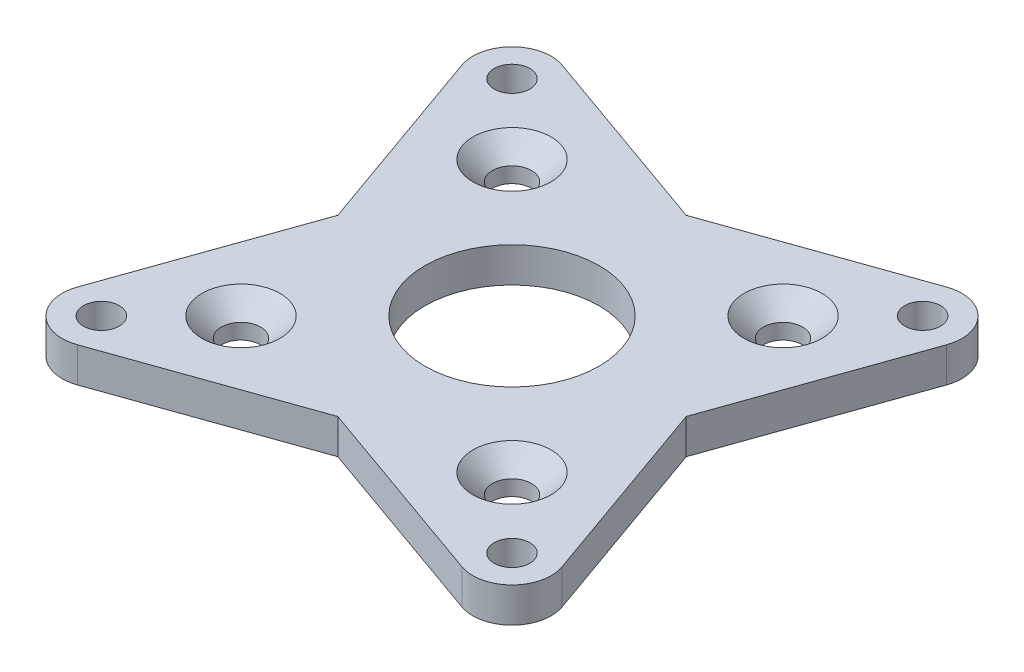
ISO-10303-21;
HEADER;
FILE_DESCRIPTION(('STEP AP214'),'2;1');
FILE_NAME('part.step','',(''),(''),'','','');
FILE_SCHEMA(('AUTOMOTIVE_DESIGN { 1 0 10303 214 1 1 1 1 }'));
ENDSEC;
DATA;
#1=APPLICATION_CONTEXT('core data for automotive mechanical design processes');
#2=APPLICATION_PROTOCOL_DEFINITION('international standard','automotive_design',2000,#1);
#3=PRODUCT_CONTEXT('',#1,'mechanical');
#4=PRODUCT('Part','Part','',(#3));
#5=PRODUCT_RELATED_PRODUCT_CATEGORY('part','',(#4));
#6=PRODUCT_DEFINITION_FORMATION('','',#4);
#7=PRODUCT_DEFINITION_CONTEXT('part definition',#1,'design');
#8=PRODUCT_DEFINITION('design','',#6,#7);
#9=PRODUCT_DEFINITION_SHAPE('','',#8);
#10=(LENGTH_UNIT() NAMED_UNIT(*) SI_UNIT(.MILLI.,.METRE.));
#11=(NAMED_UNIT(*) PLANE_ANGLE_UNIT() SI_UNIT($,.RADIAN.));
#12=(NAMED_UNIT(*) SI_UNIT($,.STERADIAN.) SOLID_ANGLE_UNIT());
#13=UNCERTAINTY_MEASURE_WITH_UNIT(LENGTH_MEASURE(1.E-05),#10,'distance_accuracy_value','');
#14=(GEOMETRIC_REPRESENTATION_CONTEXT(3) GLOBAL_UNCERTAINTY_ASSIGNED_CONTEXT((#13)) GLOBAL_UNIT_ASSIGNED_CONTEXT((#10,
#11,#12)) REPRESENTATION_CONTEXT('',''));
#15=CARTESIAN_POINT('',(0.,0.,0.));
#16=DIRECTION('',(0.,0.,1.));
#17=DIRECTION('',(1.,0.,0.));
#18=AXIS2_PLACEMENT_3D('',#15,#16,#17);
#19=CARTESIAN_POINT('',(0.,4.,0.));
#20=DIRECTION('',(0.,-1.,0.));
#21=DIRECTION('',(0.,0.,-1.));
#22=AXIS2_PLACEMENT_3D('',#19,#20,#21);
#23=PLANE('',#22);
#24=CARTESIAN_POINT('',(-15.556349186104,4.,-15.556349186104));
#25=DIRECTION('',(0.,1.,0.));
#26=DIRECTION('',(0.,0.,1.));
#27=AXIS2_PLACEMENT_3D('',#24,#25,#26);
#28=CIRCLE('',#27,4.48);
#29=CARTESIAN_POINT('',(-15.556349186104,4.,-11.076349186104));
#30=VERTEX_POINT('',#29);
#31=EDGE_CURVE('E313',#30,#30,#28,.T.);
#32=ORIENTED_EDGE('',*,*,#31,.F.);
#33=EDGE_LOOP('',(#32));
#34=FACE_BOUND('',#33,.T.);
#35=CARTESIAN_POINT('',(15.556349186104,4.,-15.556349186104));
#36=DIRECTION('',(0.,1.,0.));
#37=DIRECTION('',(0.,0.,1.));
#38=AXIS2_PLACEMENT_3D('',#35,#36,#37);
#39=CIRCLE('',#38,4.48);
#40=CARTESIAN_POINT('',(15.556349186104,4.,-11.076349186104));
#41=VERTEX_POINT('',#40);
#42=EDGE_CURVE('E304',#41,#41,#39,.T.);
#43=ORIENTED_EDGE('',*,*,#42,.F.);
#44=EDGE_LOOP('',(#43));
#45=FACE_BOUND('',#44,.T.);
#46=CARTESIAN_POINT('',(15.556349186104,4.,15.556349186104));
#47=DIRECTION('',(0.,1.,0.));
#48=DIRECTION('',(0.,0.,1.));
#49=AXIS2_PLACEMENT_3D('',#46,#47,#48);
#50=CIRCLE('',#49,4.48);
#51=CARTESIAN_POINT('',(15.556349186104,4.,20.036349186104));
#52=VERTEX_POINT('',#51);
#53=EDGE_CURVE('E295',#52,#52,#50,.T.);
#54=ORIENTED_EDGE('',*,*,#53,.F.);
#55=EDGE_LOOP('',(#54));
#56=FACE_BOUND('',#55,.T.);
#57=CARTESIAN_POINT('',(-15.556349186104,4.,15.556349186104));
#58=DIRECTION('',(0.,1.,0.));
#59=DIRECTION('',(0.,0.,1.));
#60=AXIS2_PLACEMENT_3D('',#57,#58,#59);
#61=CIRCLE('',#60,4.48);
#62=CARTESIAN_POINT('',(-15.556349186104,4.,20.036349186104));
#63=VERTEX_POINT('',#62);
#64=EDGE_CURVE('E286',#63,#63,#61,.T.);
#65=ORIENTED_EDGE('',*,*,#64,.F.);
#66=EDGE_LOOP('',(#65));
#67=FACE_BOUND('',#66,.T.);
#68=CARTESIAN_POINT('',(-23.57,4.,23.57));
#69=DIRECTION('',(0.,1.,0.));
#70=DIRECTION('',(0.,0.,1.));
#71=AXIS2_PLACEMENT_3D('',#68,#69,#70);
#72=CIRCLE('',#71,2.05000000000031);
#73=CARTESIAN_POINT('',(-23.57,4.,25.6200000000003));
#74=VERTEX_POINT('',#73);
#75=EDGE_CURVE('E247',#74,#74,#72,.T.);
#76=ORIENTED_EDGE('',*,*,#75,.F.);
#77=EDGE_LOOP('',(#76));
#78=FACE_BOUND('',#77,.T.);
#79=CARTESIAN_POINT('',(23.57,4.,23.57));
#80=DIRECTION('',(0.,1.,0.));
#81=DIRECTION('',(0.,0.,1.));
#82=AXIS2_PLACEMENT_3D('',#79,#80,#81);
#83=CIRCLE('',#82,2.05000000000021);
#84=CARTESIAN_POINT('',(23.57,4.,25.6200000000002));
#85=VERTEX_POINT('',#84);
#86=EDGE_CURVE('E240',#85,#85,#83,.T.);
#87=ORIENTED_EDGE('',*,*,#86,.F.);
#88=EDGE_LOOP('',(#87));
#89=FACE_BOUND('',#88,.T.);
#90=CARTESIAN_POINT('',(-23.57,4.,-23.57));
#91=DIRECTION('',(0.,1.,0.));
#92=DIRECTION('',(0.,0.,1.));
#93=AXIS2_PLACEMENT_3D('',#90,#91,#92);
#94=CIRCLE('',#93,2.05);
#95=CARTESIAN_POINT('',(-23.57,4.,-21.52));
#96=VERTEX_POINT('',#95);
#97=EDGE_CURVE('E12',#96,#96,#94,.T.);
#98=ORIENTED_EDGE('',*,*,#97,.F.);
#99=EDGE_LOOP('',(#98));
#100=FACE_BOUND('',#99,.T.);
#101=CARTESIAN_POINT('',(23.57,4.,-23.57));
#102=DIRECTION('',(0.,1.,0.));
#103=DIRECTION('',(0.,0.,1.));
#104=AXIS2_PLACEMENT_3D('',#101,#102,#103);
#105=CIRCLE('',#104,2.0500000000001);
#106=CARTESIAN_POINT('',(23.57,4.,-21.5199999999999));
#107=VERTEX_POINT('',#106);
#108=EDGE_CURVE('E252',#107,#107,#105,.T.);
#109=ORIENTED_EDGE('',*,*,#108,.F.);
#110=EDGE_LOOP('',(#109));
#111=FACE_BOUND('',#110,.T.);
#112=CARTESIAN_POINT('',(0.,4.,0.));
#113=DIRECTION('',(0.,1.,0.));
#114=DIRECTION('',(0.,0.,1.));
#115=AXIS2_PLACEMENT_3D('',#112,#113,#114);
#116=CIRCLE('',#115,10.);
#117=CARTESIAN_POINT('',(0.,4.,10.));
#118=VERTEX_POINT('',#117);
#119=EDGE_CURVE('E216',#118,#118,#116,.T.);
#120=ORIENTED_EDGE('',*,*,#119,.F.);
#121=EDGE_LOOP('',(#120));
#122=FACE_BOUND('',#121,.T.);
#123=DIRECTION('',(0.333702262673008,0.,0.942678524146442));
#124=VECTOR('',#123,1.);
#125=CARTESIAN_POINT('',(-27.812053358659,4.,-22.0683398179715));
#126=LINE('',#125,#124);
#127=CARTESIAN_POINT('',(-27.8120533586587,4.,-22.0683398179716));
#128=VERTEX_POINT('',#127);
#129=CARTESIAN_POINT('',(-20.,4.,0.));
#130=VERTEX_POINT('',#129);
#131=EDGE_CURVE('E181',#128,#130,#126,.T.);
#132=ORIENTED_EDGE('',*,*,#131,.T.);
#133=DIRECTION('',(-0.333702262673009,0.,0.942678524146442));
#134=VECTOR('',#133,1.);
#135=CARTESIAN_POINT('',(-20.,4.,0.));
#136=LINE('',#135,#134);
#137=CARTESIAN_POINT('',(-27.812053358659,4.,22.0683398179715));
#138=VERTEX_POINT('',#137);
#139=EDGE_CURVE('E184',#130,#138,#136,.T.);
#140=ORIENTED_EDGE('',*,*,#139,.T.);
#141=CARTESIAN_POINT('',(-23.5700000000002,4.,23.5699999999998));
#142=DIRECTION('',(0.,1.,0.));
#143=DIRECTION('',(0.,0.,1.));
#144=AXIS2_PLACEMENT_3D('',#141,#142,#143);
#145=CIRCLE('',#144,4.5);
#146=CARTESIAN_POINT('',(-22.0683398179715,4.,27.8120533586588));
#147=VERTEX_POINT('',#146);
#148=EDGE_CURVE('E59',#138,#147,#145,.T.);
#149=ORIENTED_EDGE('',*,*,#148,.T.);
#150=DIRECTION('',(0.942678524146443,0.,-0.333702262673008));
#151=VECTOR('',#150,1.);
#152=CARTESIAN_POINT('',(-22.0683398179715,4.,27.812053358659));
#153=LINE('',#152,#151);
#154=CARTESIAN_POINT('',(0.,4.,20.));
#155=VERTEX_POINT('',#154);
#156=EDGE_CURVE('E140',#147,#155,#153,.T.);
#157=ORIENTED_EDGE('',*,*,#156,.T.);
#158=DIRECTION('',(0.942678524146442,0.,0.333702262673008));
#159=VECTOR('',#158,1.);
#160=CARTESIAN_POINT('',(0.,4.,20.));
#161=LINE('',#160,#159);
#162=CARTESIAN_POINT('',(22.0683398179715,4.,27.812053358659));
#163=VERTEX_POINT('',#162);
#164=EDGE_CURVE('E190',#155,#163,#161,.T.);
#165=ORIENTED_EDGE('',*,*,#164,.T.);
#166=CARTESIAN_POINT('',(23.5699999999999,4.,23.5700000000001));
#167=DIRECTION('',(0.,1.,0.));
#168=DIRECTION('',(0.,0.,1.));
#169=AXIS2_PLACEMENT_3D('',#166,#167,#168);
#170=CIRCLE('',#169,4.5);
#171=CARTESIAN_POINT('',(27.8120533586589,4.,22.0683398179715));
#172=VERTEX_POINT('',#171);
#173=EDGE_CURVE('E193',#163,#172,#170,.T.);
#174=ORIENTED_EDGE('',*,*,#173,.T.);
#175=DIRECTION('',(-0.333702262673008,0.,-0.942678524146442));
#176=VECTOR('',#175,1.);
#177=CARTESIAN_POINT('',(27.812053358659,4.,22.0683398179715));
#178=LINE('',#177,#176);
#179=CARTESIAN_POINT('',(20.,4.,0.));
#180=VERTEX_POINT('',#179);
#181=EDGE_CURVE('E196',#172,#180,#178,.T.);
#182=ORIENTED_EDGE('',*,*,#181,.T.);
#183=DIRECTION('',(0.333702262673008,0.,-0.942678524146442));
#184=VECTOR('',#183,1.);
#185=CARTESIAN_POINT('',(20.,4.,0.));
#186=LINE('',#185,#184);
#187=CARTESIAN_POINT('',(27.812053358659,4.,-22.0683398179715));
#188=VERTEX_POINT('',#187);
#189=EDGE_CURVE('E199',#180,#188,#186,.T.);
#190=ORIENTED_EDGE('',*,*,#189,.T.);
#191=CARTESIAN_POINT('',(23.57,4.,-23.57));
#192=DIRECTION('',(0.,1.,0.));
#193=DIRECTION('',(0.,0.,1.));
#194=AXIS2_PLACEMENT_3D('',#191,#192,#193);
#195=CIRCLE('',#194,4.5);
#196=CARTESIAN_POINT('',(22.0683398179715,4.,-27.812053358659));
#197=VERTEX_POINT('',#196);
#198=EDGE_CURVE('E202',#188,#197,#195,.T.);
#199=ORIENTED_EDGE('',*,*,#198,.T.);
#200=DIRECTION('',(-0.942678524146442,0.,0.333702262673007));
#201=VECTOR('',#200,1.);
#202=CARTESIAN_POINT('',(22.0683398179715,4.,-27.812053358659));
#203=LINE('',#202,#201);
#204=CARTESIAN_POINT('',(0.,4.,-20.));
#205=VERTEX_POINT('',#204);
#206=EDGE_CURVE('E205',#197,#205,#203,.T.);
#207=ORIENTED_EDGE('',*,*,#206,.T.);
#208=DIRECTION('',(-0.942678524146442,0.,-0.333702262673008));
#209=VECTOR('',#208,1.);
#210=CARTESIAN_POINT('',(0.,4.,-20.));
#211=LINE('',#210,#209);
#212=CARTESIAN_POINT('',(-22.0683398179715,4.,-27.812053358659));
#213=VERTEX_POINT('',#212);
#214=EDGE_CURVE('E208',#205,#213,#211,.T.);
#215=ORIENTED_EDGE('',*,*,#214,.T.);
#216=CARTESIAN_POINT('',(-23.5699999999997,4.,-23.5700000000002));
#217=DIRECTION('',(0.,1.,0.));
#218=DIRECTION('',(0.,0.,1.));
#219=AXIS2_PLACEMENT_3D('',#216,#217,#218);
#220=CIRCLE('',#219,4.5);
#221=EDGE_CURVE('E211',#213,#128,#220,.T.);
#222=ORIENTED_EDGE('',*,*,#221,.T.);
#223=EDGE_LOOP('',(#132,#140,#149,#157,#165,#174,#182,#190,#199,#207,#215,#222));
#224=FACE_BOUND('',#223,.T.);
#225=ADVANCED_FACE('F44',(#34,#45,#56,#67,#78,#89,#100,#111,#122,#224),#23,.F.);
#226=CARTESIAN_POINT('',(0.,0.,0.));
#227=DIRECTION('',(0.,-1.,0.));
#228=DIRECTION('',(0.,0.,-1.));
#229=AXIS2_PLACEMENT_3D('',#226,#227,#228);
#230=PLANE('',#229);
#231=CARTESIAN_POINT('',(-15.556349186104,0.,-15.556349186104));
#232=DIRECTION('',(0.,1.,0.));
#233=DIRECTION('',(0.,0.,1.));
#234=AXIS2_PLACEMENT_3D('',#231,#232,#233);
#235=CIRCLE('',#234,2.24999999999998);
#236=CARTESIAN_POINT('',(-15.556349186104,0.,-13.3063491861041));
#237=VERTEX_POINT('',#236);
#238=EDGE_CURVE('E307',#237,#237,#235,.T.);
#239=ORIENTED_EDGE('',*,*,#238,.T.);
#240=EDGE_LOOP('',(#239));
#241=FACE_BOUND('',#240,.T.);
#242=CARTESIAN_POINT('',(15.556349186104,0.,-15.556349186104));
#243=DIRECTION('',(0.,1.,0.));
#244=DIRECTION('',(0.,0.,1.));
#245=AXIS2_PLACEMENT_3D('',#242,#243,#244);
#246=CIRCLE('',#245,2.24999999999998);
#247=CARTESIAN_POINT('',(15.556349186104,0.,-13.3063491861041));
#248=VERTEX_POINT('',#247);
#249=EDGE_CURVE('E298',#248,#248,#246,.T.);
#250=ORIENTED_EDGE('',*,*,#249,.T.);
#251=EDGE_LOOP('',(#250));
#252=FACE_BOUND('',#251,.T.);
#253=CARTESIAN_POINT('',(15.556349186104,0.,15.556349186104));
#254=DIRECTION('',(0.,1.,0.));
#255=DIRECTION('',(0.,0.,1.));
#256=AXIS2_PLACEMENT_3D('',#253,#254,#255);
#257=CIRCLE('',#256,2.24999999999998);
#258=CARTESIAN_POINT('',(15.556349186104,0.,17.806349186104));
#259=VERTEX_POINT('',#258);
#260=EDGE_CURVE('E289',#259,#259,#257,.T.);
#261=ORIENTED_EDGE('',*,*,#260,.T.);
#262=EDGE_LOOP('',(#261));
#263=FACE_BOUND('',#262,.T.);
#264=CARTESIAN_POINT('',(-15.556349186104,0.,15.556349186104));
#265=DIRECTION('',(0.,1.,0.));
#266=DIRECTION('',(0.,0.,1.));
#267=AXIS2_PLACEMENT_3D('',#264,#265,#266);
#268=CIRCLE('',#267,2.24999999999998);
#269=CARTESIAN_POINT('',(-15.556349186104,0.,17.806349186104));
#270=VERTEX_POINT('',#269);
#271=EDGE_CURVE('E185',#270,#270,#268,.T.);
#272=ORIENTED_EDGE('',*,*,#271,.T.);
#273=EDGE_LOOP('',(#272));
#274=FACE_BOUND('',#273,.T.);
#275=CARTESIAN_POINT('',(-23.57,0.,23.57));
#276=DIRECTION('',(0.,1.,0.));
#277=DIRECTION('',(0.,0.,1.));
#278=AXIS2_PLACEMENT_3D('',#275,#276,#277);
#279=CIRCLE('',#278,2.05000000000031);
#280=CARTESIAN_POINT('',(-23.57,0.,25.6200000000003));
#281=VERTEX_POINT('',#280);
#282=EDGE_CURVE('E237',#281,#281,#279,.T.);
#283=ORIENTED_EDGE('',*,*,#282,.T.);
#284=EDGE_LOOP('',(#283));
#285=FACE_BOUND('',#284,.T.);
#286=CARTESIAN_POINT('',(23.57,0.,23.57));
#287=DIRECTION('',(0.,1.,0.));
#288=DIRECTION('',(0.,0.,1.));
#289=AXIS2_PLACEMENT_3D('',#286,#287,#288);
#290=CIRCLE('',#289,2.05000000000021);
#291=CARTESIAN_POINT('',(23.57,0.,25.6200000000002));
#292=VERTEX_POINT('',#291);
#293=EDGE_CURVE('E244',#292,#292,#290,.T.);
#294=ORIENTED_EDGE('',*,*,#293,.T.);
#295=EDGE_LOOP('',(#294));
#296=FACE_BOUND('',#295,.T.);
#297=CARTESIAN_POINT('',(-23.57,0.,-23.57));
#298=DIRECTION('',(0.,1.,0.));
#299=DIRECTION('',(0.,0.,1.));
#300=AXIS2_PLACEMENT_3D('',#297,#298,#299);
#301=CIRCLE('',#300,2.05);
#302=CARTESIAN_POINT('',(-23.57,0.,-21.52));
#303=VERTEX_POINT('',#302);
#304=EDGE_CURVE('E48',#303,#303,#301,.T.);
#305=ORIENTED_EDGE('',*,*,#304,.T.);
#306=EDGE_LOOP('',(#305));
#307=FACE_BOUND('',#306,.T.);
#308=CARTESIAN_POINT('',(23.57,0.,-23.57));
#309=DIRECTION('',(0.,1.,0.));
#310=DIRECTION('',(0.,0.,1.));
#311=AXIS2_PLACEMENT_3D('',#308,#309,#310);
#312=CIRCLE('',#311,2.0500000000001);
#313=CARTESIAN_POINT('',(23.57,0.,-21.5199999999999));
#314=VERTEX_POINT('',#313);
#315=EDGE_CURVE('E243',#314,#314,#312,.T.);
#316=ORIENTED_EDGE('',*,*,#315,.T.);
#317=EDGE_LOOP('',(#316));
#318=FACE_BOUND('',#317,.T.);
#319=CARTESIAN_POINT('',(0.,0.,0.));
#320=DIRECTION('',(0.,1.,0.));
#321=DIRECTION('',(0.,0.,1.));
#322=AXIS2_PLACEMENT_3D('',#319,#320,#321);
#323=CIRCLE('',#322,10.);
#324=CARTESIAN_POINT('',(0.,0.,10.));
#325=VERTEX_POINT('',#324);
#326=EDGE_CURVE('E234',#325,#325,#323,.T.);
#327=ORIENTED_EDGE('',*,*,#326,.T.);
#328=EDGE_LOOP('',(#327));
#329=FACE_BOUND('',#328,.T.);
#330=DIRECTION('',(-0.333702262673009,0.,0.942678524146442));
#331=VECTOR('',#330,1.);
#332=CARTESIAN_POINT('',(-20.,0.,0.));
#333=LINE('',#332,#331);
#334=CARTESIAN_POINT('',(-20.,0.,0.));
#335=VERTEX_POINT('',#334);
#336=CARTESIAN_POINT('',(-27.812053358659,0.,22.0683398179715));
#337=VERTEX_POINT('',#336);
#338=EDGE_CURVE('E150',#335,#337,#333,.T.);
#339=ORIENTED_EDGE('',*,*,#338,.F.);
#340=DIRECTION('',(0.333702262673008,0.,0.942678524146442));
#341=VECTOR('',#340,1.);
#342=CARTESIAN_POINT('',(-27.812053358659,0.,-22.0683398179715));
#343=LINE('',#342,#341);
#344=CARTESIAN_POINT('',(-27.8120533586587,0.,-22.0683398179716));
#345=VERTEX_POINT('',#344);
#346=EDGE_CURVE('E67',#345,#335,#343,.T.);
#347=ORIENTED_EDGE('',*,*,#346,.F.);
#348=CARTESIAN_POINT('',(-23.5699999999997,0.,-23.5700000000002));
#349=DIRECTION('',(0.,1.,0.));
#350=DIRECTION('',(0.,0.,1.));
#351=AXIS2_PLACEMENT_3D('',#348,#349,#350);
#352=CIRCLE('',#351,4.5);
#353=CARTESIAN_POINT('',(-22.0683398179715,0.,-27.812053358659));
#354=VERTEX_POINT('',#353);
#355=EDGE_CURVE('E177',#354,#345,#352,.T.);
#356=ORIENTED_EDGE('',*,*,#355,.F.);
#357=DIRECTION('',(-0.942678524146442,0.,-0.333702262673008));
#358=VECTOR('',#357,1.);
#359=CARTESIAN_POINT('',(0.,0.,-20.));
#360=LINE('',#359,#358);
#361=CARTESIAN_POINT('',(0.,0.,-20.));
#362=VERTEX_POINT('',#361);
#363=EDGE_CURVE('E174',#362,#354,#360,.T.);
#364=ORIENTED_EDGE('',*,*,#363,.F.);
#365=DIRECTION('',(-0.942678524146442,0.,0.333702262673007));
#366=VECTOR('',#365,1.);
#367=CARTESIAN_POINT('',(22.0683398179715,0.,-27.812053358659));
#368=LINE('',#367,#366);
#369=CARTESIAN_POINT('',(22.0683398179715,0.,-27.812053358659));
#370=VERTEX_POINT('',#369);
#371=EDGE_CURVE('E171',#370,#362,#368,.T.);
#372=ORIENTED_EDGE('',*,*,#371,.F.);
#373=CARTESIAN_POINT('',(23.57,0.,-23.57));
#374=DIRECTION('',(0.,1.,0.));
#375=DIRECTION('',(0.,0.,1.));
#376=AXIS2_PLACEMENT_3D('',#373,#374,#375);
#377=CIRCLE('',#376,4.5);
#378=CARTESIAN_POINT('',(27.812053358659,0.,-22.0683398179715));
#379=VERTEX_POINT('',#378);
#380=EDGE_CURVE('E168',#379,#370,#377,.T.);
#381=ORIENTED_EDGE('',*,*,#380,.F.);
#382=DIRECTION('',(0.333702262673008,0.,-0.942678524146442));
#383=VECTOR('',#382,1.);
#384=CARTESIAN_POINT('',(20.,0.,0.));
#385=LINE('',#384,#383);
#386=CARTESIAN_POINT('',(20.,0.,0.));
#387=VERTEX_POINT('',#386);
#388=EDGE_CURVE('E165',#387,#379,#385,.T.);
#389=ORIENTED_EDGE('',*,*,#388,.F.);
#390=DIRECTION('',(-0.333702262673008,0.,-0.942678524146442));
#391=VECTOR('',#390,1.);
#392=CARTESIAN_POINT('',(27.812053358659,0.,22.0683398179715));
#393=LINE('',#392,#391);
#394=CARTESIAN_POINT('',(27.8120533586589,0.,22.0683398179715));
#395=VERTEX_POINT('',#394);
#396=EDGE_CURVE('E162',#395,#387,#393,.T.);
#397=ORIENTED_EDGE('',*,*,#396,.F.);
#398=CARTESIAN_POINT('',(23.5699999999999,0.,23.5700000000001));
#399=DIRECTION('',(0.,1.,0.));
#400=DIRECTION('',(0.,0.,1.));
#401=AXIS2_PLACEMENT_3D('',#398,#399,#400);
#402=CIRCLE('',#401,4.5);
#403=CARTESIAN_POINT('',(22.0683398179715,0.,27.812053358659));
#404=VERTEX_POINT('',#403);
#405=EDGE_CURVE('E156',#404,#395,#402,.T.);
#406=ORIENTED_EDGE('',*,*,#405,.F.);
#407=DIRECTION('',(0.942678524146442,0.,0.333702262673008));
#408=VECTOR('',#407,1.);
#409=CARTESIAN_POINT('',(0.,0.,20.));
#410=LINE('',#409,#408);
#411=CARTESIAN_POINT('',(0.,0.,20.));
#412=VERTEX_POINT('',#411);
#413=EDGE_CURVE('E154',#412,#404,#410,.T.);
#414=ORIENTED_EDGE('',*,*,#413,.F.);
#415=DIRECTION('',(0.942678524146443,0.,-0.333702262673008));
#416=VECTOR('',#415,1.);
#417=CARTESIAN_POINT('',(-22.0683398179715,0.,27.812053358659));
#418=LINE('',#417,#416);
#419=CARTESIAN_POINT('',(-22.0683398179715,0.,27.8120533586588));
#420=VERTEX_POINT('',#419);
#421=EDGE_CURVE('E137',#420,#412,#418,.T.);
#422=ORIENTED_EDGE('',*,*,#421,.F.);
#423=CARTESIAN_POINT('',(-23.5700000000002,0.,23.5699999999998));
#424=DIRECTION('',(0.,1.,0.));
#425=DIRECTION('',(0.,0.,1.));
#426=AXIS2_PLACEMENT_3D('',#423,#424,#425);
#427=CIRCLE('',#426,4.5);
#428=EDGE_CURVE('E145',#337,#420,#427,.T.);
#429=ORIENTED_EDGE('',*,*,#428,.F.);
#430=EDGE_LOOP('',(#339,#347,#356,#364,#372,#381,#389,#397,#406,#414,#422,#429));
#431=FACE_BOUND('',#430,.T.);
#432=ADVANCED_FACE('F46',(#241,#252,#263,#274,#285,#296,#307,#318,#329,#431),#230,.T.);
#433=CARTESIAN_POINT('',(-23.57,0.,23.57));
#434=DIRECTION('',(0.,1.,0.));
#435=DIRECTION('',(0.,0.,1.));
#436=AXIS2_PLACEMENT_3D('',#433,#434,#435);
#437=CYLINDRICAL_SURFACE('',#436,2.05000000000031);
#438=ORIENTED_EDGE('',*,*,#282,.F.);
#439=EDGE_LOOP('',(#438));
#440=FACE_BOUND('',#439,.T.);
#441=ORIENTED_EDGE('',*,*,#75,.T.);
#442=EDGE_LOOP('',(#441));
#443=FACE_BOUND('',#442,.T.);
#444=ADVANCED_FACE('F338',(#440,#443),#437,.F.);
#445=CARTESIAN_POINT('',(23.57,0.,23.57));
#446=DIRECTION('',(0.,1.,0.));
#447=DIRECTION('',(0.,0.,1.));
#448=AXIS2_PLACEMENT_3D('',#445,#446,#447);
#449=CYLINDRICAL_SURFACE('',#448,2.05000000000021);
#450=ORIENTED_EDGE('',*,*,#293,.F.);
#451=EDGE_LOOP('',(#450));
#452=FACE_BOUND('',#451,.T.);
#453=ORIENTED_EDGE('',*,*,#86,.T.);
#454=EDGE_LOOP('',(#453));
#455=FACE_BOUND('',#454,.T.);
#456=ADVANCED_FACE('F332',(#452,#455),#449,.F.);
#457=CARTESIAN_POINT('',(-23.57,0.,-23.57));
#458=DIRECTION('',(0.,1.,0.));
#459=DIRECTION('',(0.,0.,1.));
#460=AXIS2_PLACEMENT_3D('',#457,#458,#459);
#461=CYLINDRICAL_SURFACE('',#460,2.05);
#462=ORIENTED_EDGE('',*,*,#304,.F.);
#463=EDGE_LOOP('',(#462));
#464=FACE_BOUND('',#463,.T.);
#465=ORIENTED_EDGE('',*,*,#97,.T.);
#466=EDGE_LOOP('',(#465));
#467=FACE_BOUND('',#466,.T.);
#468=ADVANCED_FACE('F264',(#464,#467),#461,.F.);
#469=CARTESIAN_POINT('',(23.57,0.,-23.57));
#470=DIRECTION('',(0.,1.,0.));
#471=DIRECTION('',(0.,0.,1.));
#472=AXIS2_PLACEMENT_3D('',#469,#470,#471);
#473=CYLINDRICAL_SURFACE('',#472,2.0500000000001);
#474=ORIENTED_EDGE('',*,*,#315,.F.);
#475=EDGE_LOOP('',(#474));
#476=FACE_BOUND('',#475,.T.);
#477=ORIENTED_EDGE('',*,*,#108,.T.);
#478=EDGE_LOOP('',(#477));
#479=FACE_BOUND('',#478,.T.);
#480=ADVANCED_FACE('F260',(#476,#479),#473,.F.);
#481=CARTESIAN_POINT('',(0.,0.,0.));
#482=DIRECTION('',(0.,1.,0.));
#483=DIRECTION('',(0.,0.,1.));
#484=AXIS2_PLACEMENT_3D('',#481,#482,#483);
#485=CYLINDRICAL_SURFACE('',#484,10.);
#486=ORIENTED_EDGE('',*,*,#326,.F.);
#487=EDGE_LOOP('',(#486));
#488=FACE_BOUND('',#487,.T.);
#489=ORIENTED_EDGE('',*,*,#119,.T.);
#490=EDGE_LOOP('',(#489));
#491=FACE_BOUND('',#490,.T.);
#492=ADVANCED_FACE('F263',(#488,#491),#485,.F.);
#493=CARTESIAN_POINT('',(-27.812053358659,0.,-22.0683398179715));
#494=DIRECTION('',(-0.942678524146442,0.,0.333702262673008));
#495=DIRECTION('',(0.333702262673008,0.,0.942678524146442));
#496=AXIS2_PLACEMENT_3D('',#493,#494,#495);
#497=PLANE('',#496);
#498=ORIENTED_EDGE('',*,*,#131,.F.);
#499=DIRECTION('',(0.,1.,0.));
#500=VECTOR('',#499,1.);
#501=CARTESIAN_POINT('',(-27.8120533586587,0.,-22.0683398179716));
#502=LINE('',#501,#500);
#503=EDGE_CURVE('E214',#345,#128,#502,.T.);
#504=ORIENTED_EDGE('',*,*,#503,.F.);
#505=ORIENTED_EDGE('',*,*,#346,.T.);
#506=DIRECTION('',(0.,1.,0.));
#507=VECTOR('',#506,1.);
#508=CARTESIAN_POINT('',(-20.,0.,0.));
#509=LINE('',#508,#507);
#510=EDGE_CURVE('E180',#335,#130,#509,.T.);
#511=ORIENTED_EDGE('',*,*,#510,.T.);
#512=EDGE_LOOP('',(#498,#504,#505,#511));
#513=FACE_BOUND('',#512,.T.);
#514=ADVANCED_FACE('F276',(#513),#497,.T.);
#515=CARTESIAN_POINT('',(-23.5699999999997,0.,-23.5700000000002));
#516=DIRECTION('',(0.,1.,0.));
#517=DIRECTION('',(0.,0.,1.));
#518=AXIS2_PLACEMENT_3D('',#515,#516,#517);
#519=CYLINDRICAL_SURFACE('',#518,4.5);
#520=ORIENTED_EDGE('',*,*,#221,.F.);
#521=DIRECTION('',(0.,1.,0.));
#522=VECTOR('',#521,1.);
#523=CARTESIAN_POINT('',(-22.0683398179715,0.,-27.812053358659));
#524=LINE('',#523,#522);
#525=EDGE_CURVE('E217',#354,#213,#524,.T.);
#526=ORIENTED_EDGE('',*,*,#525,.F.);
#527=ORIENTED_EDGE('',*,*,#355,.T.);
#528=ORIENTED_EDGE('',*,*,#503,.T.);
#529=EDGE_LOOP('',(#520,#526,#527,#528));
#530=FACE_BOUND('',#529,.T.);
#531=ADVANCED_FACE('F351',(#530),#519,.T.);
#532=CARTESIAN_POINT('',(0.,0.,-20.));
#533=DIRECTION('',(0.333702262673009,0.,-0.942678524146442));
#534=DIRECTION('',(-0.942678524146442,0.,-0.333702262673009));
#535=AXIS2_PLACEMENT_3D('',#532,#533,#534);
#536=PLANE('',#535);
#537=ORIENTED_EDGE('',*,*,#214,.F.);
#538=DIRECTION('',(0.,1.,0.));
#539=VECTOR('',#538,1.);
#540=CARTESIAN_POINT('',(0.,0.,-20.));
#541=LINE('',#540,#539);
#542=EDGE_CURVE('E219',#362,#205,#541,.T.);
#543=ORIENTED_EDGE('',*,*,#542,.F.);
#544=ORIENTED_EDGE('',*,*,#363,.T.);
#545=ORIENTED_EDGE('',*,*,#525,.T.);
#546=EDGE_LOOP('',(#537,#543,#544,#545));
#547=FACE_BOUND('',#546,.T.);
#548=ADVANCED_FACE('F382',(#547),#536,.T.);
#549=CARTESIAN_POINT('',(22.0683398179715,0.,-27.812053358659));
#550=DIRECTION('',(-0.333702262673008,0.,-0.942678524146443));
#551=DIRECTION('',(-0.942678524146442,0.,0.333702262673008));
#552=AXIS2_PLACEMENT_3D('',#549,#550,#551);
#553=PLANE('',#552);
#554=ORIENTED_EDGE('',*,*,#206,.F.);
#555=DIRECTION('',(0.,1.,0.));
#556=VECTOR('',#555,1.);
#557=CARTESIAN_POINT('',(22.0683398179715,0.,-27.812053358659));
#558=LINE('',#557,#556);
#559=EDGE_CURVE('E221',#370,#197,#558,.T.);
#560=ORIENTED_EDGE('',*,*,#559,.F.);
#561=ORIENTED_EDGE('',*,*,#371,.T.);
#562=ORIENTED_EDGE('',*,*,#542,.T.);
#563=EDGE_LOOP('',(#554,#560,#561,#562));
#564=FACE_BOUND('',#563,.T.);
#565=ADVANCED_FACE('F378',(#564),#553,.T.);
#566=CARTESIAN_POINT('',(23.57,0.,-23.57));
#567=DIRECTION('',(0.,1.,0.));
#568=DIRECTION('',(0.,0.,1.));
#569=AXIS2_PLACEMENT_3D('',#566,#567,#568);
#570=CYLINDRICAL_SURFACE('',#569,4.5);
#571=ORIENTED_EDGE('',*,*,#198,.F.);
#572=DIRECTION('',(0.,1.,0.));
#573=VECTOR('',#572,1.);
#574=CARTESIAN_POINT('',(27.812053358659,0.,-22.0683398179715));
#575=LINE('',#574,#573);
#576=EDGE_CURVE('E223',#379,#188,#575,.T.);
#577=ORIENTED_EDGE('',*,*,#576,.F.);
#578=ORIENTED_EDGE('',*,*,#380,.T.);
#579=ORIENTED_EDGE('',*,*,#559,.T.);
#580=EDGE_LOOP('',(#571,#577,#578,#579));
#581=FACE_BOUND('',#580,.T.);
#582=ADVANCED_FACE('F374',(#581),#570,.T.);
#583=CARTESIAN_POINT('',(20.,0.,0.));
#584=DIRECTION('',(0.942678524146442,0.,0.333702262673009));
#585=DIRECTION('',(0.333702262673009,0.,-0.942678524146442));
#586=AXIS2_PLACEMENT_3D('',#583,#584,#585);
#587=PLANE('',#586);
#588=ORIENTED_EDGE('',*,*,#189,.F.);
#589=DIRECTION('',(0.,1.,0.));
#590=VECTOR('',#589,1.);
#591=CARTESIAN_POINT('',(20.,0.,0.));
#592=LINE('',#591,#590);
#593=EDGE_CURVE('E225',#387,#180,#592,.T.);
#594=ORIENTED_EDGE('',*,*,#593,.F.);
#595=ORIENTED_EDGE('',*,*,#388,.T.);
#596=ORIENTED_EDGE('',*,*,#576,.T.);
#597=EDGE_LOOP('',(#588,#594,#595,#596));
#598=FACE_BOUND('',#597,.T.);
#599=ADVANCED_FACE('F370',(#598),#587,.T.);
#600=CARTESIAN_POINT('',(27.812053358659,0.,22.0683398179715));
#601=DIRECTION('',(0.942678524146443,0.,-0.333702262673008));
#602=DIRECTION('',(-0.333702262673008,0.,-0.942678524146443));
#603=AXIS2_PLACEMENT_3D('',#600,#601,#602);
#604=PLANE('',#603);
#605=ORIENTED_EDGE('',*,*,#181,.F.);
#606=DIRECTION('',(0.,1.,0.));
#607=VECTOR('',#606,1.);
#608=CARTESIAN_POINT('',(27.8120533586589,0.,22.0683398179715));
#609=LINE('',#608,#607);
#610=EDGE_CURVE('E227',#395,#172,#609,.T.);
#611=ORIENTED_EDGE('',*,*,#610,.F.);
#612=ORIENTED_EDGE('',*,*,#396,.T.);
#613=ORIENTED_EDGE('',*,*,#593,.T.);
#614=EDGE_LOOP('',(#605,#611,#612,#613));
#615=FACE_BOUND('',#614,.T.);
#616=ADVANCED_FACE('F366',(#615),#604,.T.);
#617=CARTESIAN_POINT('',(23.5699999999999,0.,23.5700000000001));
#618=DIRECTION('',(0.,1.,0.));
#619=DIRECTION('',(0.,0.,1.));
#620=AXIS2_PLACEMENT_3D('',#617,#618,#619);
#621=CYLINDRICAL_SURFACE('',#620,4.5);
#622=ORIENTED_EDGE('',*,*,#173,.F.);
#623=DIRECTION('',(0.,1.,0.));
#624=VECTOR('',#623,1.);
#625=CARTESIAN_POINT('',(22.0683398179715,0.,27.812053358659));
#626=LINE('',#625,#624);
#627=EDGE_CURVE('E229',#404,#163,#626,.T.);
#628=ORIENTED_EDGE('',*,*,#627,.F.);
#629=ORIENTED_EDGE('',*,*,#405,.T.);
#630=ORIENTED_EDGE('',*,*,#610,.T.);
#631=EDGE_LOOP('',(#622,#628,#629,#630));
#632=FACE_BOUND('',#631,.T.);
#633=ADVANCED_FACE('F362',(#632),#621,.T.);
#634=CARTESIAN_POINT('',(0.,0.,20.));
#635=DIRECTION('',(-0.333702262673009,0.,0.942678524146442));
#636=DIRECTION('',(0.942678524146442,0.,0.333702262673009));
#637=AXIS2_PLACEMENT_3D('',#634,#635,#636);
#638=PLANE('',#637);
#639=ORIENTED_EDGE('',*,*,#164,.F.);
#640=DIRECTION('',(0.,1.,0.));
#641=VECTOR('',#640,1.);
#642=CARTESIAN_POINT('',(0.,0.,20.));
#643=LINE('',#642,#641);
#644=EDGE_CURVE('E141',#412,#155,#643,.T.);
#645=ORIENTED_EDGE('',*,*,#644,.F.);
#646=ORIENTED_EDGE('',*,*,#413,.T.);
#647=ORIENTED_EDGE('',*,*,#627,.T.);
#648=EDGE_LOOP('',(#639,#645,#646,#647));
#649=FACE_BOUND('',#648,.T.);
#650=ADVANCED_FACE('F359',(#649),#638,.T.);
#651=CARTESIAN_POINT('',(-22.0683398179715,0.,27.812053358659));
#652=DIRECTION('',(0.333702262673008,0.,0.942678524146443));
#653=DIRECTION('',(0.942678524146443,0.,-0.333702262673008));
#654=AXIS2_PLACEMENT_3D('',#651,#652,#653);
#655=PLANE('',#654);
#656=ORIENTED_EDGE('',*,*,#156,.F.);
#657=DIRECTION('',(0.,1.,0.));
#658=VECTOR('',#657,1.);
#659=CARTESIAN_POINT('',(-22.0683398179715,0.,27.8120533586588));
#660=LINE('',#659,#658);
#661=EDGE_CURVE('E133',#420,#147,#660,.T.);
#662=ORIENTED_EDGE('',*,*,#661,.F.);
#663=ORIENTED_EDGE('',*,*,#421,.T.);
#664=ORIENTED_EDGE('',*,*,#644,.T.);
#665=EDGE_LOOP('',(#656,#662,#663,#664));
#666=FACE_BOUND('',#665,.T.);
#667=ADVANCED_FACE('F135',(#666),#655,.T.);
#668=CARTESIAN_POINT('',(-23.5700000000002,0.,23.5699999999998));
#669=DIRECTION('',(0.,1.,0.));
#670=DIRECTION('',(0.,0.,1.));
#671=AXIS2_PLACEMENT_3D('',#668,#669,#670);
#672=CYLINDRICAL_SURFACE('',#671,4.5);
#673=ORIENTED_EDGE('',*,*,#148,.F.);
#674=DIRECTION('',(0.,1.,0.));
#675=VECTOR('',#674,1.);
#676=CARTESIAN_POINT('',(-27.812053358659,0.,22.0683398179715));
#677=LINE('',#676,#675);
#678=EDGE_CURVE('E142',#337,#138,#677,.T.);
#679=ORIENTED_EDGE('',*,*,#678,.F.);
#680=ORIENTED_EDGE('',*,*,#428,.T.);
#681=ORIENTED_EDGE('',*,*,#661,.T.);
#682=EDGE_LOOP('',(#673,#679,#680,#681));
#683=FACE_BOUND('',#682,.T.);
#684=ADVANCED_FACE('F146',(#683),#672,.T.);
#685=CARTESIAN_POINT('',(-20.,0.,0.));
#686=DIRECTION('',(-0.942678524146442,0.,-0.333702262673009));
#687=DIRECTION('',(-0.333702262673009,0.,0.942678524146442));
#688=AXIS2_PLACEMENT_3D('',#685,#686,#687);
#689=PLANE('',#688);
#690=ORIENTED_EDGE('',*,*,#139,.F.);
#691=ORIENTED_EDGE('',*,*,#510,.F.);
#692=ORIENTED_EDGE('',*,*,#338,.T.);
#693=ORIENTED_EDGE('',*,*,#678,.T.);
#694=EDGE_LOOP('',(#690,#691,#692,#693));
#695=FACE_BOUND('',#694,.T.);
#696=ADVANCED_FACE('F278',(#695),#689,.T.);
#697=CARTESIAN_POINT('',(-15.556349186104,4.,15.556349186104));
#698=DIRECTION('',(0.,1.,0.));
#699=DIRECTION('',(0.,0.,1.));
#700=AXIS2_PLACEMENT_3D('',#697,#698,#699);
#701=CYLINDRICAL_SURFACE('',#700,2.24999999999998);
#702=ORIENTED_EDGE('',*,*,#271,.F.);
#703=EDGE_LOOP('',(#702));
#704=FACE_BOUND('',#703,.T.);
#705=CARTESIAN_POINT('',(-15.556349186104,1.76999999999998,15.556349186104));
#706=DIRECTION('',(0.,1.,0.));
#707=DIRECTION('',(0.,0.,1.));
#708=AXIS2_PLACEMENT_3D('',#705,#706,#707);
#709=CIRCLE('',#708,2.24999999999998);
#710=CARTESIAN_POINT('',(-15.556349186104,1.76999999999998,17.806349186104));
#711=VERTEX_POINT('',#710);
#712=EDGE_CURVE('E283',#711,#711,#709,.T.);
#713=ORIENTED_EDGE('',*,*,#712,.T.);
#714=EDGE_LOOP('',(#713));
#715=FACE_BOUND('',#714,.T.);
#716=ADVANCED_FACE('F354',(#704,#715),#701,.F.);
#717=CARTESIAN_POINT('',(-15.556349186104,4.,15.556349186104));
#718=DIRECTION('',(0.,1.,0.));
#719=DIRECTION('',(0.,0.,1.));
#720=AXIS2_PLACEMENT_3D('',#717,#718,#719);
#721=CONICAL_SURFACE('',#720,4.48,0.785398163397447);
#722=ORIENTED_EDGE('',*,*,#712,.F.);
#723=EDGE_LOOP('',(#722));
#724=FACE_BOUND('',#723,.T.);
#725=ORIENTED_EDGE('',*,*,#64,.T.);
#726=EDGE_LOOP('',(#725));
#727=FACE_BOUND('',#726,.T.);
#728=ADVANCED_FACE('F392',(#724,#727),#721,.F.);
#729=CARTESIAN_POINT('',(15.556349186104,4.,15.556349186104));
#730=DIRECTION('',(0.,1.,0.));
#731=DIRECTION('',(0.,0.,1.));
#732=AXIS2_PLACEMENT_3D('',#729,#730,#731);
#733=CYLINDRICAL_SURFACE('',#732,2.24999999999998);
#734=ORIENTED_EDGE('',*,*,#260,.F.);
#735=EDGE_LOOP('',(#734));
#736=FACE_BOUND('',#735,.T.);
#737=CARTESIAN_POINT('',(15.556349186104,1.76999999999998,15.556349186104));
#738=DIRECTION('',(0.,1.,0.));
#739=DIRECTION('',(0.,0.,1.));
#740=AXIS2_PLACEMENT_3D('',#737,#738,#739);
#741=CIRCLE('',#740,2.24999999999998);
#742=CARTESIAN_POINT('',(15.556349186104,1.76999999999998,17.806349186104));
#743=VERTEX_POINT('',#742);
#744=EDGE_CURVE('E292',#743,#743,#741,.T.);
#745=ORIENTED_EDGE('',*,*,#744,.T.);
#746=EDGE_LOOP('',(#745));
#747=FACE_BOUND('',#746,.T.);
#748=ADVANCED_FACE('F396',(#736,#747),#733,.F.);
#749=CARTESIAN_POINT('',(15.556349186104,4.,15.556349186104));
#750=DIRECTION('',(0.,1.,0.));
#751=DIRECTION('',(0.,0.,1.));
#752=AXIS2_PLACEMENT_3D('',#749,#750,#751);
#753=CONICAL_SURFACE('',#752,4.48,0.785398163397447);
#754=ORIENTED_EDGE('',*,*,#744,.F.);
#755=EDGE_LOOP('',(#754));
#756=FACE_BOUND('',#755,.T.);
#757=ORIENTED_EDGE('',*,*,#53,.T.);
#758=EDGE_LOOP('',(#757));
#759=FACE_BOUND('',#758,.T.);
#760=ADVANCED_FACE('F400',(#756,#759),#753,.F.);
#761=CARTESIAN_POINT('',(15.556349186104,4.,-15.556349186104));
#762=DIRECTION('',(0.,1.,0.));
#763=DIRECTION('',(0.,0.,1.));
#764=AXIS2_PLACEMENT_3D('',#761,#762,#763);
#765=CYLINDRICAL_SURFACE('',#764,2.24999999999998);
#766=ORIENTED_EDGE('',*,*,#249,.F.);
#767=EDGE_LOOP('',(#766));
#768=FACE_BOUND('',#767,.T.);
#769=CARTESIAN_POINT('',(15.556349186104,1.76999999999998,-15.556349186104));
#770=DIRECTION('',(0.,1.,0.));
#771=DIRECTION('',(0.,0.,1.));
#772=AXIS2_PLACEMENT_3D('',#769,#770,#771);
#773=CIRCLE('',#772,2.24999999999999);
#774=CARTESIAN_POINT('',(15.556349186104,1.76999999999998,-13.3063491861041));
#775=VERTEX_POINT('',#774);
#776=EDGE_CURVE('E301',#775,#775,#773,.T.);
#777=ORIENTED_EDGE('',*,*,#776,.T.);
#778=EDGE_LOOP('',(#777));
#779=FACE_BOUND('',#778,.T.);
#780=ADVANCED_FACE('F404',(#768,#779),#765,.F.);
#781=CARTESIAN_POINT('',(15.556349186104,4.,-15.556349186104));
#782=DIRECTION('',(0.,1.,0.));
#783=DIRECTION('',(0.,0.,1.));
#784=AXIS2_PLACEMENT_3D('',#781,#782,#783);
#785=CONICAL_SURFACE('',#784,4.48,0.785398163397446);
#786=ORIENTED_EDGE('',*,*,#776,.F.);
#787=EDGE_LOOP('',(#786));
#788=FACE_BOUND('',#787,.T.);
#789=ORIENTED_EDGE('',*,*,#42,.T.);
#790=EDGE_LOOP('',(#789));
#791=FACE_BOUND('',#790,.T.);
#792=ADVANCED_FACE('F408',(#788,#791),#785,.F.);
#793=CARTESIAN_POINT('',(-15.556349186104,4.,-15.556349186104));
#794=DIRECTION('',(0.,1.,0.));
#795=DIRECTION('',(0.,0.,1.));
#796=AXIS2_PLACEMENT_3D('',#793,#794,#795);
#797=CYLINDRICAL_SURFACE('',#796,2.24999999999998);
#798=ORIENTED_EDGE('',*,*,#238,.F.);
#799=EDGE_LOOP('',(#798));
#800=FACE_BOUND('',#799,.T.);
#801=CARTESIAN_POINT('',(-15.556349186104,1.76999999999998,-15.556349186104));
#802=DIRECTION('',(0.,1.,0.));
#803=DIRECTION('',(0.,0.,1.));
#804=AXIS2_PLACEMENT_3D('',#801,#802,#803);
#805=CIRCLE('',#804,2.24999999999998);
#806=CARTESIAN_POINT('',(-15.556349186104,1.76999999999998,-13.3063491861041));
#807=VERTEX_POINT('',#806);
#808=EDGE_CURVE('E310',#807,#807,#805,.T.);
#809=ORIENTED_EDGE('',*,*,#808,.T.);
#810=EDGE_LOOP('',(#809));
#811=FACE_BOUND('',#810,.T.);
#812=ADVANCED_FACE('F412',(#800,#811),#797,.F.);
#813=CARTESIAN_POINT('',(-15.556349186104,4.,-15.556349186104));
#814=DIRECTION('',(0.,1.,0.));
#815=DIRECTION('',(0.,0.,1.));
#816=AXIS2_PLACEMENT_3D('',#813,#814,#815);
#817=CONICAL_SURFACE('',#816,4.48,0.785398163397447);
#818=ORIENTED_EDGE('',*,*,#808,.F.);
#819=EDGE_LOOP('',(#818));
#820=FACE_BOUND('',#819,.T.);
#821=ORIENTED_EDGE('',*,*,#31,.T.);
#822=EDGE_LOOP('',(#821));
#823=FACE_BOUND('',#822,.T.);
#824=ADVANCED_FACE('F317',(#820,#823),#817,.F.);
#825=CLOSED_SHELL('',(#225,#432,#444,#456,#468,#480,#492,#514,#531,#548,#565,#582,#599,#616,
#633,#650,#667,#684,#696,#716,#728,#748,#760,#780,#792,#812,#824));
#826=MANIFOLD_SOLID_BREP('B2',#825);
#827=ADVANCED_BREP_SHAPE_REPRESENTATION('',(#18,#826),#14);
#828=SHAPE_DEFINITION_REPRESENTATION(#9,#827);
ENDSEC;
END-ISO-10303-21;
